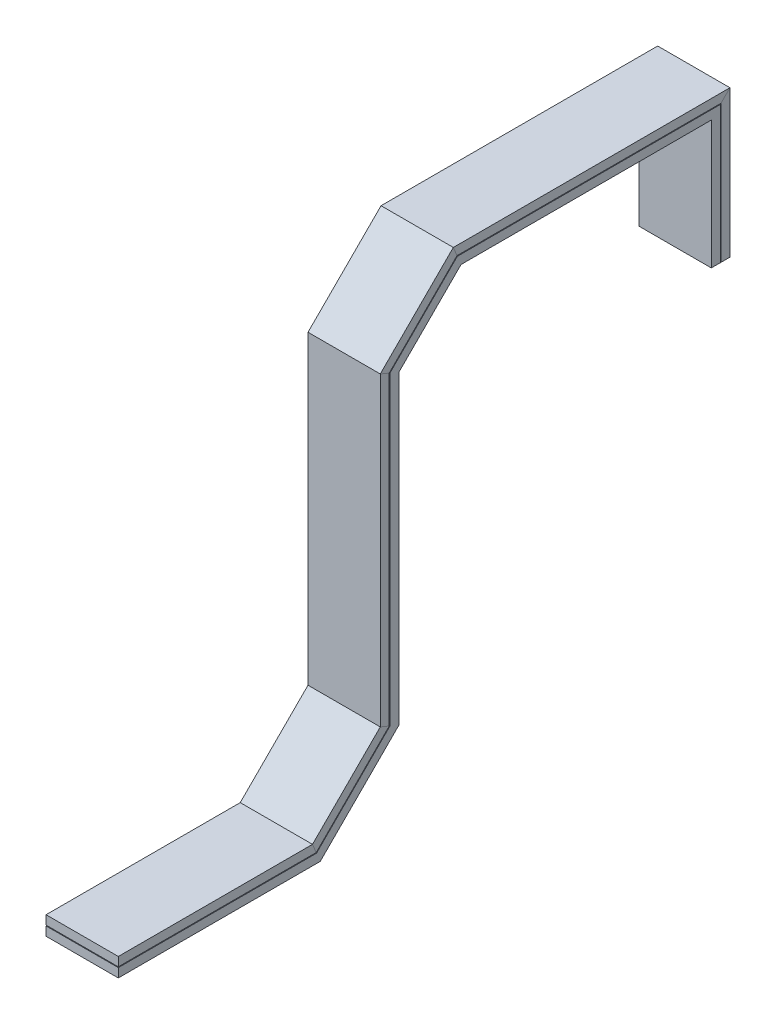
ISO-10303-21;
HEADER;
FILE_DESCRIPTION(('STEP AP214'),'2;1');
FILE_NAME('part.step','',(''),(''),'','','');
FILE_SCHEMA(('AUTOMOTIVE_DESIGN { 1 0 10303 214 1 1 1 1 }'));
ENDSEC;
DATA;
#1=APPLICATION_CONTEXT('core data for automotive mechanical design processes');
#2=APPLICATION_PROTOCOL_DEFINITION('international standard','automotive_design',2000,#1);
#3=PRODUCT_CONTEXT('',#1,'mechanical');
#4=PRODUCT('Part','Part','',(#3));
#5=PRODUCT_RELATED_PRODUCT_CATEGORY('part','',(#4));
#6=PRODUCT_DEFINITION_FORMATION('','',#4);
#7=PRODUCT_DEFINITION_CONTEXT('part definition',#1,'design');
#8=PRODUCT_DEFINITION('design','',#6,#7);
#9=PRODUCT_DEFINITION_SHAPE('','',#8);
#10=(LENGTH_UNIT() NAMED_UNIT(*) SI_UNIT(.MILLI.,.METRE.));
#11=(NAMED_UNIT(*) PLANE_ANGLE_UNIT() SI_UNIT($,.RADIAN.));
#12=(NAMED_UNIT(*) SI_UNIT($,.STERADIAN.) SOLID_ANGLE_UNIT());
#13=UNCERTAINTY_MEASURE_WITH_UNIT(LENGTH_MEASURE(1.E-05),#10,'distance_accuracy_value','');
#14=(GEOMETRIC_REPRESENTATION_CONTEXT(3) GLOBAL_UNCERTAINTY_ASSIGNED_CONTEXT((#13)) GLOBAL_UNIT_ASSIGNED_CONTEXT((#10,
#11,#12)) REPRESENTATION_CONTEXT('',''));
#15=CARTESIAN_POINT('',(0.,0.,0.));
#16=DIRECTION('',(0.,0.,1.));
#17=DIRECTION('',(1.,0.,0.));
#18=AXIS2_PLACEMENT_3D('',#15,#16,#17);
#19=CARTESIAN_POINT('',(25.4,0.,3.655));
#20=DIRECTION('',(0.,-1.,0.));
#21=DIRECTION('',(0.,0.,-1.));
#22=AXIS2_PLACEMENT_3D('',#19,#20,#21);
#23=PLANE('',#22);
#24=DIRECTION('',(0.,0.,1.));
#25=VECTOR('',#24,1.);
#26=CARTESIAN_POINT('',(-25.4,0.,3.655));
#27=LINE('',#26,#25);
#28=CARTESIAN_POINT('',(-25.4,0.,3.655));
#29=VERTEX_POINT('',#28);
#30=CARTESIAN_POINT('',(-25.4,0.,9.965));
#31=VERTEX_POINT('',#30);
#32=EDGE_CURVE('E178',#29,#31,#27,.T.);
#33=ORIENTED_EDGE('',*,*,#32,.F.);
#34=DIRECTION('',(-1.,0.,0.));
#35=VECTOR('',#34,1.);
#36=CARTESIAN_POINT('',(25.4,0.,3.655));
#37=LINE('',#36,#35);
#38=CARTESIAN_POINT('',(25.4,0.,3.655));
#39=VERTEX_POINT('',#38);
#40=EDGE_CURVE('E12',#39,#29,#37,.T.);
#41=ORIENTED_EDGE('',*,*,#40,.F.);
#42=DIRECTION('',(0.,0.,1.));
#43=VECTOR('',#42,1.);
#44=CARTESIAN_POINT('',(25.4,0.,3.655));
#45=LINE('',#44,#43);
#46=CARTESIAN_POINT('',(25.4,0.,9.965));
#47=VERTEX_POINT('',#46);
#48=EDGE_CURVE('E216',#39,#47,#45,.T.);
#49=ORIENTED_EDGE('',*,*,#48,.T.);
#50=DIRECTION('',(-1.,0.,0.));
#51=VECTOR('',#50,1.);
#52=CARTESIAN_POINT('',(25.4,0.,9.965));
#53=LINE('',#52,#51);
#54=EDGE_CURVE('E48',#47,#31,#53,.T.);
#55=ORIENTED_EDGE('',*,*,#54,.T.);
#56=EDGE_LOOP('',(#33,#41,#49,#55));
#57=FACE_BOUND('',#56,.T.);
#58=ADVANCED_FACE('F45',(#57),#23,.T.);
#59=CARTESIAN_POINT('',(25.4,0.,3.655));
#60=DIRECTION('',(0.,0.,-1.));
#61=DIRECTION('',(-1.,0.,0.));
#62=AXIS2_PLACEMENT_3D('',#59,#60,#61);
#63=PLANE('',#62);
#64=DIRECTION('',(0.,-1.,0.));
#65=VECTOR('',#64,1.);
#66=CARTESIAN_POINT('',(-25.4,0.,3.655));
#67=LINE('',#66,#65);
#68=CARTESIAN_POINT('',(-25.4,96.345,3.655));
#69=VERTEX_POINT('',#68);
#70=EDGE_CURVE('E214',#69,#29,#67,.T.);
#71=ORIENTED_EDGE('',*,*,#70,.F.);
#72=DIRECTION('',(-1.,0.,0.));
#73=VECTOR('',#72,1.);
#74=CARTESIAN_POINT('',(25.4,96.345,3.655));
#75=LINE('',#74,#73);
#76=CARTESIAN_POINT('',(25.4,96.345,3.655));
#77=VERTEX_POINT('',#76);
#78=EDGE_CURVE('E54',#77,#69,#75,.T.);
#79=ORIENTED_EDGE('',*,*,#78,.F.);
#80=DIRECTION('',(0.,-1.,0.));
#81=VECTOR('',#80,1.);
#82=CARTESIAN_POINT('',(25.4,0.,3.655));
#83=LINE('',#82,#81);
#84=EDGE_CURVE('E168',#77,#39,#83,.T.);
#85=ORIENTED_EDGE('',*,*,#84,.T.);
#86=ORIENTED_EDGE('',*,*,#40,.T.);
#87=EDGE_LOOP('',(#71,#79,#85,#86));
#88=FACE_BOUND('',#87,.T.);
#89=ADVANCED_FACE('F240',(#88),#63,.T.);
#90=CARTESIAN_POINT('',(25.4,96.345,3.655));
#91=DIRECTION('',(0.,1.,0.));
#92=DIRECTION('',(0.,0.,1.));
#93=AXIS2_PLACEMENT_3D('',#90,#91,#92);
#94=PLANE('',#93);
#95=DIRECTION('',(0.,0.,-1.));
#96=VECTOR('',#95,1.);
#97=CARTESIAN_POINT('',(-25.4,96.345,3.655));
#98=LINE('',#97,#96);
#99=CARTESIAN_POINT('',(-25.4,96.345,188.486049429528));
#100=VERTEX_POINT('',#99);
#101=EDGE_CURVE('E155',#100,#69,#98,.T.);
#102=ORIENTED_EDGE('',*,*,#101,.F.);
#103=DIRECTION('',(-1.,0.,0.));
#104=VECTOR('',#103,1.);
#105=CARTESIAN_POINT('',(25.4,96.345,188.486049429528));
#106=LINE('',#105,#104);
#107=CARTESIAN_POINT('',(25.4,96.345,188.486049429528));
#108=VERTEX_POINT('',#107);
#109=EDGE_CURVE('E150',#108,#100,#106,.T.);
#110=ORIENTED_EDGE('',*,*,#109,.F.);
#111=DIRECTION('',(0.,0.,-1.));
#112=VECTOR('',#111,1.);
#113=CARTESIAN_POINT('',(25.4,96.345,3.655));
#114=LINE('',#113,#112);
#115=EDGE_CURVE('E153',#108,#77,#114,.T.);
#116=ORIENTED_EDGE('',*,*,#115,.T.);
#117=ORIENTED_EDGE('',*,*,#78,.T.);
#118=EDGE_LOOP('',(#102,#110,#116,#117));
#119=FACE_BOUND('',#118,.T.);
#120=ADVANCED_FACE('F152',(#119),#94,.T.);
#121=CARTESIAN_POINT('',(25.4,96.345,188.486049429528));
#122=DIRECTION('',(0.,0.707106781186442,0.707106781186653));
#123=DIRECTION('',(0.,-0.707106781186653,0.707106781186442));
#124=AXIS2_PLACEMENT_3D('',#121,#122,#123);
#125=PLANE('',#124);
#126=DIRECTION('',(0.,0.707106781186653,-0.707106781186442));
#127=VECTOR('',#126,1.);
#128=CARTESIAN_POINT('',(-25.4,96.345,188.486049429528));
#129=LINE('',#128,#127);
#130=CARTESIAN_POINT('',(-25.4,48.9885747464298,235.842474683084));
#131=VERTEX_POINT('',#130);
#132=EDGE_CURVE('E211',#131,#100,#129,.T.);
#133=ORIENTED_EDGE('',*,*,#132,.F.);
#134=DIRECTION('',(-1.,0.,0.));
#135=VECTOR('',#134,1.);
#136=CARTESIAN_POINT('',(25.4,48.9885747464298,235.842474683084));
#137=LINE('',#136,#135);
#138=CARTESIAN_POINT('',(25.4,48.9885747464298,235.842474683084));
#139=VERTEX_POINT('',#138);
#140=EDGE_CURVE('E160',#139,#131,#137,.T.);
#141=ORIENTED_EDGE('',*,*,#140,.F.);
#142=DIRECTION('',(0.,0.707106781186653,-0.707106781186442));
#143=VECTOR('',#142,1.);
#144=CARTESIAN_POINT('',(25.4,96.345,188.486049429528));
#145=LINE('',#144,#143);
#146=EDGE_CURVE('E166',#139,#108,#145,.T.);
#147=ORIENTED_EDGE('',*,*,#146,.T.);
#148=ORIENTED_EDGE('',*,*,#109,.T.);
#149=EDGE_LOOP('',(#133,#141,#147,#148));
#150=FACE_BOUND('',#149,.T.);
#151=ADVANCED_FACE('F170',(#150),#125,.T.);
#152=CARTESIAN_POINT('',(25.4,48.9885747464298,235.842474683084));
#153=DIRECTION('',(0.,0.,1.));
#154=DIRECTION('',(0.,-1.,0.));
#155=AXIS2_PLACEMENT_3D('',#152,#153,#154);
#156=PLANE('',#155);
#157=DIRECTION('',(0.,1.,0.));
#158=VECTOR('',#157,1.);
#159=CARTESIAN_POINT('',(-25.4,48.9885747464298,235.842474683084));
#160=LINE('',#159,#158);
#161=CARTESIAN_POINT('',(-25.4,-165.896475887446,235.842474683084));
#162=VERTEX_POINT('',#161);
#163=EDGE_CURVE('E208',#162,#131,#160,.T.);
#164=ORIENTED_EDGE('',*,*,#163,.F.);
#165=DIRECTION('',(-1.,0.,0.));
#166=VECTOR('',#165,1.);
#167=CARTESIAN_POINT('',(25.4,-165.896475887446,235.842474683084));
#168=LINE('',#167,#166);
#169=CARTESIAN_POINT('',(25.4,-165.896475887446,235.842474683084));
#170=VERTEX_POINT('',#169);
#171=EDGE_CURVE('E220',#170,#162,#168,.T.);
#172=ORIENTED_EDGE('',*,*,#171,.F.);
#173=DIRECTION('',(0.,1.,0.));
#174=VECTOR('',#173,1.);
#175=CARTESIAN_POINT('',(25.4,48.9885747464298,235.842474683084));
#176=LINE('',#175,#174);
#177=EDGE_CURVE('E171',#170,#139,#176,.T.);
#178=ORIENTED_EDGE('',*,*,#177,.T.);
#179=ORIENTED_EDGE('',*,*,#140,.T.);
#180=EDGE_LOOP('',(#164,#172,#178,#179));
#181=FACE_BOUND('',#180,.T.);
#182=ADVANCED_FACE('F253',(#181),#156,.T.);
#183=CARTESIAN_POINT('',(25.4,-165.896475887446,235.842474683084));
#184=DIRECTION('',(0.,0.707106781186443,0.707106781186652));
#185=DIRECTION('',(0.,-0.707106781186652,0.707106781186443));
#186=AXIS2_PLACEMENT_3D('',#183,#184,#185);
#187=PLANE('',#186);
#188=DIRECTION('',(0.,0.707106781186652,-0.707106781186443));
#189=VECTOR('',#188,1.);
#190=CARTESIAN_POINT('',(-25.4,-165.896475887446,235.842474683084));
#191=LINE('',#190,#189);
#192=CARTESIAN_POINT('',(-25.4,-217.535000000027,287.48099879565));
#193=VERTEX_POINT('',#192);
#194=EDGE_CURVE('E205',#193,#162,#191,.T.);
#195=ORIENTED_EDGE('',*,*,#194,.F.);
#196=DIRECTION('',(-1.,0.,0.));
#197=VECTOR('',#196,1.);
#198=CARTESIAN_POINT('',(25.4,-217.535000000027,287.48099879565));
#199=LINE('',#198,#197);
#200=CARTESIAN_POINT('',(25.4,-217.535000000027,287.48099879565));
#201=VERTEX_POINT('',#200);
#202=EDGE_CURVE('E222',#201,#193,#199,.T.);
#203=ORIENTED_EDGE('',*,*,#202,.F.);
#204=DIRECTION('',(0.,0.707106781186652,-0.707106781186443));
#205=VECTOR('',#204,1.);
#206=CARTESIAN_POINT('',(25.4,-165.896475887446,235.842474683084));
#207=LINE('',#206,#205);
#208=EDGE_CURVE('E173',#201,#170,#207,.T.);
#209=ORIENTED_EDGE('',*,*,#208,.T.);
#210=ORIENTED_EDGE('',*,*,#171,.T.);
#211=EDGE_LOOP('',(#195,#203,#209,#210));
#212=FACE_BOUND('',#211,.T.);
#213=ADVANCED_FACE('F256',(#212),#187,.T.);
#214=CARTESIAN_POINT('',(25.4,-217.535000000027,287.48099879565));
#215=DIRECTION('',(0.,1.,0.));
#216=DIRECTION('',(0.,0.,1.));
#217=AXIS2_PLACEMENT_3D('',#214,#215,#216);
#218=PLANE('',#217);
#219=DIRECTION('',(0.,0.,-1.));
#220=VECTOR('',#219,1.);
#221=CARTESIAN_POINT('',(-25.4,-217.535000000027,287.48099879565));
#222=LINE('',#221,#220);
#223=CARTESIAN_POINT('',(-25.4,-217.535000000027,426.794949366123));
#224=VERTEX_POINT('',#223);
#225=EDGE_CURVE('E202',#224,#193,#222,.T.);
#226=ORIENTED_EDGE('',*,*,#225,.F.);
#227=DIRECTION('',(-1.,0.,0.));
#228=VECTOR('',#227,1.);
#229=CARTESIAN_POINT('',(25.4,-217.535000000027,426.794949366123));
#230=LINE('',#229,#228);
#231=CARTESIAN_POINT('',(25.4,-217.535000000027,426.794949366123));
#232=VERTEX_POINT('',#231);
#233=EDGE_CURVE('E224',#232,#224,#230,.T.);
#234=ORIENTED_EDGE('',*,*,#233,.F.);
#235=DIRECTION('',(0.,0.,-1.));
#236=VECTOR('',#235,1.);
#237=CARTESIAN_POINT('',(25.4,-217.535000000027,287.48099879565));
#238=LINE('',#237,#236);
#239=EDGE_CURVE('E413',#232,#201,#238,.T.);
#240=ORIENTED_EDGE('',*,*,#239,.T.);
#241=ORIENTED_EDGE('',*,*,#202,.T.);
#242=EDGE_LOOP('',(#226,#234,#240,#241));
#243=FACE_BOUND('',#242,.T.);
#244=ADVANCED_FACE('F260',(#243),#218,.T.);
#245=CARTESIAN_POINT('',(25.4,-217.535000000027,426.794949366123));
#246=DIRECTION('',(0.,0.,1.));
#247=DIRECTION('',(1.,0.,0.));
#248=AXIS2_PLACEMENT_3D('',#245,#246,#247);
#249=PLANE('',#248);
#250=DIRECTION('',(0.,1.,0.));
#251=VECTOR('',#250,1.);
#252=CARTESIAN_POINT('',(-25.4,-217.535000000027,426.794949366123));
#253=LINE('',#252,#251);
#254=CARTESIAN_POINT('',(-25.4,-223.845000000027,426.794949366123));
#255=VERTEX_POINT('',#254);
#256=EDGE_CURVE('E199',#255,#224,#253,.T.);
#257=ORIENTED_EDGE('',*,*,#256,.F.);
#258=DIRECTION('',(-1.,0.,0.));
#259=VECTOR('',#258,1.);
#260=CARTESIAN_POINT('',(25.4,-223.845000000027,426.794949366123));
#261=LINE('',#260,#259);
#262=CARTESIAN_POINT('',(25.4,-223.845000000027,426.794949366123));
#263=VERTEX_POINT('',#262);
#264=EDGE_CURVE('E226',#263,#255,#261,.T.);
#265=ORIENTED_EDGE('',*,*,#264,.F.);
#266=DIRECTION('',(0.,1.,0.));
#267=VECTOR('',#266,1.);
#268=CARTESIAN_POINT('',(25.4,-217.535000000027,426.794949366123));
#269=LINE('',#268,#267);
#270=EDGE_CURVE('E406',#263,#232,#269,.T.);
#271=ORIENTED_EDGE('',*,*,#270,.T.);
#272=ORIENTED_EDGE('',*,*,#233,.T.);
#273=EDGE_LOOP('',(#257,#265,#271,#272));
#274=FACE_BOUND('',#273,.T.);
#275=ADVANCED_FACE('F264',(#274),#249,.T.);
#276=CARTESIAN_POINT('',(25.4,-223.845000000027,284.867311217075));
#277=DIRECTION('',(0.,-1.,0.));
#278=DIRECTION('',(0.,0.,-1.));
#279=AXIS2_PLACEMENT_3D('',#276,#277,#278);
#280=PLANE('',#279);
#281=DIRECTION('',(0.,0.,1.));
#282=VECTOR('',#281,1.);
#283=CARTESIAN_POINT('',(-25.4,-223.845000000027,284.867311217075));
#284=LINE('',#283,#282);
#285=CARTESIAN_POINT('',(-25.4,-223.845000000027,284.867311217075));
#286=VERTEX_POINT('',#285);
#287=EDGE_CURVE('E196',#286,#255,#284,.T.);
#288=ORIENTED_EDGE('',*,*,#287,.F.);
#289=DIRECTION('',(-1.,0.,0.));
#290=VECTOR('',#289,1.);
#291=CARTESIAN_POINT('',(25.4,-223.845000000027,284.867311217075));
#292=LINE('',#291,#290);
#293=CARTESIAN_POINT('',(25.4,-223.845000000027,284.867311217075));
#294=VERTEX_POINT('',#293);
#295=EDGE_CURVE('E228',#294,#286,#292,.T.);
#296=ORIENTED_EDGE('',*,*,#295,.F.);
#297=DIRECTION('',(0.,0.,1.));
#298=VECTOR('',#297,1.);
#299=CARTESIAN_POINT('',(25.4,-223.845000000027,284.867311217075));
#300=LINE('',#299,#298);
#301=EDGE_CURVE('E402',#294,#263,#300,.T.);
#302=ORIENTED_EDGE('',*,*,#301,.T.);
#303=ORIENTED_EDGE('',*,*,#264,.T.);
#304=EDGE_LOOP('',(#288,#296,#302,#303));
#305=FACE_BOUND('',#304,.T.);
#306=ADVANCED_FACE('F268',(#305),#280,.T.);
#307=CARTESIAN_POINT('',(25.4,-168.51016346602,229.532474683084));
#308=DIRECTION('',(0.,-0.70710678118645,-0.707106781186645));
#309=DIRECTION('',(0.,0.707106781186645,-0.70710678118645));
#310=AXIS2_PLACEMENT_3D('',#307,#308,#309);
#311=PLANE('',#310);
#312=DIRECTION('',(0.,-0.707106781186645,0.70710678118645));
#313=VECTOR('',#312,1.);
#314=CARTESIAN_POINT('',(-25.4,-168.51016346602,229.532474683084));
#315=LINE('',#314,#313);
#316=CARTESIAN_POINT('',(-25.4,-168.51016346602,229.532474683084));
#317=VERTEX_POINT('',#316);
#318=EDGE_CURVE('E193',#317,#286,#315,.T.);
#319=ORIENTED_EDGE('',*,*,#318,.F.);
#320=DIRECTION('',(-1.,0.,0.));
#321=VECTOR('',#320,1.);
#322=CARTESIAN_POINT('',(25.4,-168.51016346602,229.532474683084));
#323=LINE('',#322,#321);
#324=CARTESIAN_POINT('',(25.4,-168.51016346602,229.532474683084));
#325=VERTEX_POINT('',#324);
#326=EDGE_CURVE('E230',#325,#317,#323,.T.);
#327=ORIENTED_EDGE('',*,*,#326,.F.);
#328=DIRECTION('',(0.,-0.707106781186645,0.70710678118645));
#329=VECTOR('',#328,1.);
#330=CARTESIAN_POINT('',(25.4,-168.51016346602,229.532474683084));
#331=LINE('',#330,#329);
#332=EDGE_CURVE('E418',#325,#294,#331,.T.);
#333=ORIENTED_EDGE('',*,*,#332,.T.);
#334=ORIENTED_EDGE('',*,*,#295,.T.);
#335=EDGE_LOOP('',(#319,#327,#333,#334));
#336=FACE_BOUND('',#335,.T.);
#337=ADVANCED_FACE('F272',(#336),#311,.T.);
#338=CARTESIAN_POINT('',(25.4,46.3748871678561,229.532474683084));
#339=DIRECTION('',(0.,0.,-1.));
#340=DIRECTION('',(0.,1.,0.));
#341=AXIS2_PLACEMENT_3D('',#338,#339,#340);
#342=PLANE('',#341);
#343=DIRECTION('',(0.,-1.,0.));
#344=VECTOR('',#343,1.);
#345=CARTESIAN_POINT('',(-25.4,46.3748871678561,229.532474683084));
#346=LINE('',#345,#344);
#347=CARTESIAN_POINT('',(-25.4,46.3748871678561,229.532474683084));
#348=VERTEX_POINT('',#347);
#349=EDGE_CURVE('E190',#348,#317,#346,.T.);
#350=ORIENTED_EDGE('',*,*,#349,.F.);
#351=DIRECTION('',(-1.,0.,0.));
#352=VECTOR('',#351,1.);
#353=CARTESIAN_POINT('',(25.4,46.3748871678561,229.532474683084));
#354=LINE('',#353,#352);
#355=CARTESIAN_POINT('',(25.4,46.3748871678561,229.532474683084));
#356=VERTEX_POINT('',#355);
#357=EDGE_CURVE('E232',#356,#348,#354,.T.);
#358=ORIENTED_EDGE('',*,*,#357,.F.);
#359=DIRECTION('',(0.,-1.,0.));
#360=VECTOR('',#359,1.);
#361=CARTESIAN_POINT('',(25.4,46.3748871678561,229.532474683084));
#362=LINE('',#361,#360);
#363=EDGE_CURVE('E395',#356,#325,#362,.T.);
#364=ORIENTED_EDGE('',*,*,#363,.T.);
#365=ORIENTED_EDGE('',*,*,#326,.T.);
#366=EDGE_LOOP('',(#350,#358,#364,#365));
#367=FACE_BOUND('',#366,.T.);
#368=ADVANCED_FACE('F276',(#367),#342,.T.);
#369=CARTESIAN_POINT('',(25.4,90.035,185.872361850954));
#370=DIRECTION('',(0.,-0.707106781186433,-0.707106781186661));
#371=DIRECTION('',(0.,0.707106781186662,-0.707106781186433));
#372=AXIS2_PLACEMENT_3D('',#369,#370,#371);
#373=PLANE('',#372);
#374=DIRECTION('',(0.,-0.707106781186662,0.707106781186434));
#375=VECTOR('',#374,1.);
#376=CARTESIAN_POINT('',(-25.4,90.035,185.872361850954));
#377=LINE('',#376,#375);
#378=CARTESIAN_POINT('',(-25.4,90.035,185.872361850954));
#379=VERTEX_POINT('',#378);
#380=EDGE_CURVE('E187',#379,#348,#377,.T.);
#381=ORIENTED_EDGE('',*,*,#380,.F.);
#382=DIRECTION('',(-1.,0.,0.));
#383=VECTOR('',#382,1.);
#384=CARTESIAN_POINT('',(25.4,90.035,185.872361850954));
#385=LINE('',#384,#383);
#386=CARTESIAN_POINT('',(25.4,90.035,185.872361850954));
#387=VERTEX_POINT('',#386);
#388=EDGE_CURVE('E234',#387,#379,#385,.T.);
#389=ORIENTED_EDGE('',*,*,#388,.F.);
#390=DIRECTION('',(0.,-0.707106781186662,0.707106781186434));
#391=VECTOR('',#390,1.);
#392=CARTESIAN_POINT('',(25.4,90.035,185.872361850954));
#393=LINE('',#392,#391);
#394=EDGE_CURVE('E391',#387,#356,#393,.T.);
#395=ORIENTED_EDGE('',*,*,#394,.T.);
#396=ORIENTED_EDGE('',*,*,#357,.T.);
#397=EDGE_LOOP('',(#381,#389,#395,#396));
#398=FACE_BOUND('',#397,.T.);
#399=ADVANCED_FACE('F280',(#398),#373,.T.);
#400=CARTESIAN_POINT('',(25.4,90.035,9.965));
#401=DIRECTION('',(0.,-1.,0.));
#402=DIRECTION('',(0.,0.,-1.));
#403=AXIS2_PLACEMENT_3D('',#400,#401,#402);
#404=PLANE('',#403);
#405=DIRECTION('',(0.,0.,1.));
#406=VECTOR('',#405,1.);
#407=CARTESIAN_POINT('',(-25.4,90.035,9.965));
#408=LINE('',#407,#406);
#409=CARTESIAN_POINT('',(-25.4,90.035,9.965));
#410=VERTEX_POINT('',#409);
#411=EDGE_CURVE('E184',#410,#379,#408,.T.);
#412=ORIENTED_EDGE('',*,*,#411,.F.);
#413=DIRECTION('',(-1.,0.,0.));
#414=VECTOR('',#413,1.);
#415=CARTESIAN_POINT('',(25.4,90.035,9.965));
#416=LINE('',#415,#414);
#417=CARTESIAN_POINT('',(25.4,90.035,9.965));
#418=VERTEX_POINT('',#417);
#419=EDGE_CURVE('E235',#418,#410,#416,.T.);
#420=ORIENTED_EDGE('',*,*,#419,.F.);
#421=DIRECTION('',(0.,0.,1.));
#422=VECTOR('',#421,1.);
#423=CARTESIAN_POINT('',(25.4,90.035,9.965));
#424=LINE('',#423,#422);
#425=EDGE_CURVE('E422',#418,#387,#424,.T.);
#426=ORIENTED_EDGE('',*,*,#425,.T.);
#427=ORIENTED_EDGE('',*,*,#388,.T.);
#428=EDGE_LOOP('',(#412,#420,#426,#427));
#429=FACE_BOUND('',#428,.T.);
#430=ADVANCED_FACE('F284',(#429),#404,.T.);
#431=CARTESIAN_POINT('',(25.4,0.,9.965));
#432=DIRECTION('',(0.,0.,1.));
#433=DIRECTION('',(1.,0.,0.));
#434=AXIS2_PLACEMENT_3D('',#431,#432,#433);
#435=PLANE('',#434);
#436=DIRECTION('',(0.,1.,0.));
#437=VECTOR('',#436,1.);
#438=CARTESIAN_POINT('',(-25.4,0.,9.965));
#439=LINE('',#438,#437);
#440=EDGE_CURVE('E181',#31,#410,#439,.T.);
#441=ORIENTED_EDGE('',*,*,#440,.F.);
#442=ORIENTED_EDGE('',*,*,#54,.F.);
#443=DIRECTION('',(0.,1.,0.));
#444=VECTOR('',#443,1.);
#445=CARTESIAN_POINT('',(25.4,0.,9.965));
#446=LINE('',#445,#444);
#447=EDGE_CURVE('E424',#47,#418,#446,.T.);
#448=ORIENTED_EDGE('',*,*,#447,.T.);
#449=ORIENTED_EDGE('',*,*,#419,.T.);
#450=EDGE_LOOP('',(#441,#442,#448,#449));
#451=FACE_BOUND('',#450,.T.);
#452=ADVANCED_FACE('F237',(#451),#435,.T.);
#453=CARTESIAN_POINT('',(25.4,0.,0.));
#454=DIRECTION('',(-1.,0.,0.));
#455=DIRECTION('',(0.,0.,1.));
#456=AXIS2_PLACEMENT_3D('',#453,#454,#455);
#457=PLANE('',#456);
#458=ORIENTED_EDGE('',*,*,#48,.F.);
#459=ORIENTED_EDGE('',*,*,#84,.F.);
#460=ORIENTED_EDGE('',*,*,#115,.F.);
#461=ORIENTED_EDGE('',*,*,#146,.F.);
#462=ORIENTED_EDGE('',*,*,#177,.F.);
#463=ORIENTED_EDGE('',*,*,#208,.F.);
#464=ORIENTED_EDGE('',*,*,#239,.F.);
#465=ORIENTED_EDGE('',*,*,#270,.F.);
#466=ORIENTED_EDGE('',*,*,#301,.F.);
#467=ORIENTED_EDGE('',*,*,#332,.F.);
#468=ORIENTED_EDGE('',*,*,#363,.F.);
#469=ORIENTED_EDGE('',*,*,#394,.F.);
#470=ORIENTED_EDGE('',*,*,#425,.F.);
#471=ORIENTED_EDGE('',*,*,#447,.F.);
#472=EDGE_LOOP('',(#458,#459,#460,#461,#462,#463,#464,#465,#466,#467,#468,#469,#470,#471));
#473=FACE_BOUND('',#472,.T.);
#474=ADVANCED_FACE('F164',(#473),#457,.F.);
#475=CARTESIAN_POINT('',(-25.4,0.,0.));
#476=DIRECTION('',(-1.,0.,0.));
#477=DIRECTION('',(0.,0.,1.));
#478=AXIS2_PLACEMENT_3D('',#475,#476,#477);
#479=PLANE('',#478);
#480=ORIENTED_EDGE('',*,*,#32,.T.);
#481=ORIENTED_EDGE('',*,*,#440,.T.);
#482=ORIENTED_EDGE('',*,*,#411,.T.);
#483=ORIENTED_EDGE('',*,*,#380,.T.);
#484=ORIENTED_EDGE('',*,*,#349,.T.);
#485=ORIENTED_EDGE('',*,*,#318,.T.);
#486=ORIENTED_EDGE('',*,*,#287,.T.);
#487=ORIENTED_EDGE('',*,*,#256,.T.);
#488=ORIENTED_EDGE('',*,*,#225,.T.);
#489=ORIENTED_EDGE('',*,*,#194,.T.);
#490=ORIENTED_EDGE('',*,*,#163,.T.);
#491=ORIENTED_EDGE('',*,*,#132,.T.);
#492=ORIENTED_EDGE('',*,*,#101,.T.);
#493=ORIENTED_EDGE('',*,*,#70,.T.);
#494=EDGE_LOOP('',(#480,#481,#482,#483,#484,#485,#486,#487,#488,#489,#490,#491,#492,#493));
#495=FACE_BOUND('',#494,.T.);
#496=ADVANCED_FACE('F239',(#495),#479,.T.);
#497=CLOSED_SHELL('',(#58,#89,#120,#151,#182,#213,#244,#275,#306,#337,#368,#399,#430,#452,#474,#496));
#498=MANIFOLD_SOLID_BREP('B2',#497);
#499=CARTESIAN_POINT('',(5.84511048808304E-12,-213.880000000029,426.794949366123));
#500=DIRECTION('',(0.,0.,1.));
#501=DIRECTION('',(0.,-1.,0.));
#502=AXIS2_PLACEMENT_3D('',#499,#500,#501);
#503=PLANE('',#502);
#504=DIRECTION('',(0.,1.,0.));
#505=VECTOR('',#504,1.);
#506=CARTESIAN_POINT('',(25.4000000000061,-210.725000000031,426.794949366123));
#507=LINE('',#506,#505);
#508=CARTESIAN_POINT('',(25.4000000000055,-217.035000000031,426.794949366123));
#509=VERTEX_POINT('',#508);
#510=CARTESIAN_POINT('',(25.4000000000061,-210.725000000031,426.794949366123));
#511=VERTEX_POINT('',#510);
#512=EDGE_CURVE('E516',#509,#511,#507,.T.);
#513=ORIENTED_EDGE('',*,*,#512,.T.);
#514=DIRECTION('',(-1.,0.,0.));
#515=VECTOR('',#514,1.);
#516=CARTESIAN_POINT('',(-25.3999999999939,-210.725000000027,426.794949366123));
#517=LINE('',#516,#515);
#518=CARTESIAN_POINT('',(-25.3999999999939,-210.725000000027,426.794949366123));
#519=VERTEX_POINT('',#518);
#520=EDGE_CURVE('E514',#511,#519,#517,.T.);
#521=ORIENTED_EDGE('',*,*,#520,.T.);
#522=DIRECTION('',(0.,-1.,0.));
#523=VECTOR('',#522,1.);
#524=CARTESIAN_POINT('',(-25.3999999999939,-210.725000000027,426.794949366123));
#525=LINE('',#524,#523);
#526=CARTESIAN_POINT('',(-25.3999999999945,-217.035000000027,426.794949366123));
#527=VERTEX_POINT('',#526);
#528=EDGE_CURVE('E511',#519,#527,#525,.T.);
#529=ORIENTED_EDGE('',*,*,#528,.T.);
#530=DIRECTION('',(1.,0.,0.));
#531=VECTOR('',#530,1.);
#532=CARTESIAN_POINT('',(-25.3999999999945,-217.035000000027,426.794949366123));
#533=LINE('',#532,#531);
#534=EDGE_CURVE('E530',#527,#509,#533,.T.);
#535=ORIENTED_EDGE('',*,*,#534,.T.);
#536=EDGE_LOOP('',(#513,#521,#529,#535));
#537=FACE_BOUND('',#536,.T.);
#538=ADVANCED_FACE('F429',(#537),#503,.T.);
#539=CARTESIAN_POINT('',(0.,0.,0.));
#540=DIRECTION('',(0.,1.,0.));
#541=DIRECTION('',(0.,0.,1.));
#542=AXIS2_PLACEMENT_3D('',#539,#540,#541);
#543=PLANE('',#542);
#544=DIRECTION('',(0.,0.,-1.));
#545=VECTOR('',#544,1.);
#546=CARTESIAN_POINT('',(25.4,0.,-3.155));
#547=LINE('',#546,#545);
#548=CARTESIAN_POINT('',(25.4,0.,3.155));
#549=VERTEX_POINT('',#548);
#550=CARTESIAN_POINT('',(25.4,0.,-3.155));
#551=VERTEX_POINT('',#550);
#552=EDGE_CURVE('E644',#549,#551,#547,.T.);
#553=ORIENTED_EDGE('',*,*,#552,.F.);
#554=DIRECTION('',(1.,0.,0.));
#555=VECTOR('',#554,1.);
#556=CARTESIAN_POINT('',(-25.4,0.,3.155));
#557=LINE('',#556,#555);
#558=CARTESIAN_POINT('',(-25.4,0.,3.155));
#559=VERTEX_POINT('',#558);
#560=EDGE_CURVE('E650',#559,#549,#557,.T.);
#561=ORIENTED_EDGE('',*,*,#560,.F.);
#562=DIRECTION('',(0.,0.,1.));
#563=VECTOR('',#562,1.);
#564=CARTESIAN_POINT('',(-25.4,0.,-3.155));
#565=LINE('',#564,#563);
#566=CARTESIAN_POINT('',(-25.4,0.,-3.155));
#567=VERTEX_POINT('',#566);
#568=EDGE_CURVE('E634',#567,#559,#565,.T.);
#569=ORIENTED_EDGE('',*,*,#568,.F.);
#570=DIRECTION('',(-1.,0.,0.));
#571=VECTOR('',#570,1.);
#572=CARTESIAN_POINT('',(-25.4,0.,-3.155));
#573=LINE('',#572,#571);
#574=EDGE_CURVE('E640',#551,#567,#573,.T.);
#575=ORIENTED_EDGE('',*,*,#574,.F.);
#576=EDGE_LOOP('',(#553,#561,#569,#575));
#577=FACE_BOUND('',#576,.T.);
#578=ADVANCED_FACE('F683',(#577),#543,.F.);
#579=CARTESIAN_POINT('',(-25.3999999999939,-210.725000000027,287.457421197906));
#580=DIRECTION('',(-1.,0.,0.));
#581=DIRECTION('',(0.,-1.,0.));
#582=AXIS2_PLACEMENT_3D('',#579,#580,#581);
#583=PLANE('',#582);
#584=DIRECTION('',(0.,0.923879532511259,0.382683432365158));
#585=VECTOR('',#584,1.);
#586=CARTESIAN_POINT('',(-25.3999999999915,-185.894703414158,300.586838759027));
#587=LINE('',#586,#585);
#588=CARTESIAN_POINT('',(-25.3999999999945,-217.035000000027,287.688105576837));
#589=VERTEX_POINT('',#588);
#590=CARTESIAN_POINT('',(-25.3999999999939,-210.725000000027,290.301793155411));
#591=VERTEX_POINT('',#590);
#592=EDGE_CURVE('E546',#589,#591,#587,.T.);
#593=ORIENTED_EDGE('',*,*,#592,.F.);
#594=DIRECTION('',(0.,0.,1.));
#595=VECTOR('',#594,1.);
#596=CARTESIAN_POINT('',(-25.3999999999945,-217.035000000027,287.457421197906));
#597=LINE('',#596,#595);
#598=EDGE_CURVE('E528',#589,#527,#597,.T.);
#599=ORIENTED_EDGE('',*,*,#598,.T.);
#600=ORIENTED_EDGE('',*,*,#528,.F.);
#601=DIRECTION('',(0.,0.,1.));
#602=VECTOR('',#601,1.);
#603=CARTESIAN_POINT('',(-25.3999999999939,-210.725000000027,287.457421197906));
#604=LINE('',#603,#602);
#605=EDGE_CURVE('E432',#591,#519,#604,.T.);
#606=ORIENTED_EDGE('',*,*,#605,.F.);
#607=EDGE_LOOP('',(#593,#599,#600,#606));
#608=FACE_BOUND('',#607,.T.);
#609=ADVANCED_FACE('F525',(#608),#583,.T.);
#610=CARTESIAN_POINT('',(-25.3999999999945,-217.035000000027,287.457421197906));
#611=DIRECTION('',(0.,-1.,0.));
#612=DIRECTION('',(1.,0.,0.));
#613=AXIS2_PLACEMENT_3D('',#610,#611,#612);
#614=PLANE('',#613);
#615=DIRECTION('',(-1.,0.,0.));
#616=VECTOR('',#615,1.);
#617=CARTESIAN_POINT('',(-25.3999999999969,-217.035000000027,287.688105576837));
#618=LINE('',#617,#616);
#619=CARTESIAN_POINT('',(25.4000000000055,-217.035000000031,287.688105576835));
#620=VERTEX_POINT('',#619);
#621=EDGE_CURVE('E560',#620,#589,#618,.T.);
#622=ORIENTED_EDGE('',*,*,#621,.F.);
#623=DIRECTION('',(0.,0.,1.));
#624=VECTOR('',#623,1.);
#625=CARTESIAN_POINT('',(25.4000000000055,-217.035000000031,287.457421197906));
#626=LINE('',#625,#624);
#627=EDGE_CURVE('E539',#620,#509,#626,.T.);
#628=ORIENTED_EDGE('',*,*,#627,.T.);
#629=ORIENTED_EDGE('',*,*,#534,.F.);
#630=ORIENTED_EDGE('',*,*,#598,.F.);
#631=EDGE_LOOP('',(#622,#628,#629,#630));
#632=FACE_BOUND('',#631,.T.);
#633=ADVANCED_FACE('F740',(#632),#614,.T.);
#634=CARTESIAN_POINT('',(25.4000000000061,-210.725000000031,287.457421197906));
#635=DIRECTION('',(1.,0.,0.));
#636=DIRECTION('',(0.,1.,0.));
#637=AXIS2_PLACEMENT_3D('',#634,#635,#636);
#638=PLANE('',#637);
#639=DIRECTION('',(0.,-0.923879532511259,-0.382683432365158));
#640=VECTOR('',#639,1.);
#641=CARTESIAN_POINT('',(25.4000000000085,-185.894703414162,300.586838759025));
#642=LINE('',#641,#640);
#643=CARTESIAN_POINT('',(25.4000000000061,-210.725000000031,290.30179315541));
#644=VERTEX_POINT('',#643);
#645=EDGE_CURVE('E557',#644,#620,#642,.T.);
#646=ORIENTED_EDGE('',*,*,#645,.F.);
#647=DIRECTION('',(0.,0.,1.));
#648=VECTOR('',#647,1.);
#649=CARTESIAN_POINT('',(25.4000000000061,-210.725000000031,287.457421197906));
#650=LINE('',#649,#648);
#651=EDGE_CURVE('E529',#644,#511,#650,.T.);
#652=ORIENTED_EDGE('',*,*,#651,.T.);
#653=ORIENTED_EDGE('',*,*,#512,.F.);
#654=ORIENTED_EDGE('',*,*,#627,.F.);
#655=EDGE_LOOP('',(#646,#652,#653,#654));
#656=FACE_BOUND('',#655,.T.);
#657=ADVANCED_FACE('F743',(#656),#638,.T.);
#658=CARTESIAN_POINT('',(-25.3999999999939,-210.725000000027,287.457421197906));
#659=DIRECTION('',(0.,1.,0.));
#660=DIRECTION('',(-1.,0.,0.));
#661=AXIS2_PLACEMENT_3D('',#658,#659,#660);
#662=PLANE('',#661);
#663=DIRECTION('',(1.,0.,0.));
#664=VECTOR('',#663,1.);
#665=CARTESIAN_POINT('',(-25.3999999999963,-210.725000000027,290.301793155411));
#666=LINE('',#665,#664);
#667=EDGE_CURVE('E534',#591,#644,#666,.T.);
#668=ORIENTED_EDGE('',*,*,#667,.F.);
#669=ORIENTED_EDGE('',*,*,#605,.T.);
#670=ORIENTED_EDGE('',*,*,#520,.F.);
#671=ORIENTED_EDGE('',*,*,#651,.F.);
#672=EDGE_LOOP('',(#668,#669,#670,#671));
#673=FACE_BOUND('',#672,.T.);
#674=ADVANCED_FACE('F532',(#673),#662,.T.);
#675=CARTESIAN_POINT('',(-25.3999999999932,-161.064406828289,240.641199983688));
#676=DIRECTION('',(0.,0.707106781186443,0.707106781186652));
#677=DIRECTION('',(0.,-0.707106781186652,0.707106781186443));
#678=AXIS2_PLACEMENT_3D('',#675,#676,#677);
#679=PLANE('',#678);
#680=DIRECTION('',(0.,-0.707106781186652,0.707106781186443));
#681=VECTOR('',#680,1.);
#682=CARTESIAN_POINT('',(-25.3999999999932,-161.064406828289,240.641199983688));
#683=LINE('',#682,#681);
#684=CARTESIAN_POINT('',(-25.3999999999933,-163.075681527658,242.652474683057));
#685=VERTEX_POINT('',#684);
#686=EDGE_CURVE('E548',#685,#591,#683,.T.);
#687=ORIENTED_EDGE('',*,*,#686,.T.);
#688=ORIENTED_EDGE('',*,*,#667,.T.);
#689=DIRECTION('',(0.,-0.707106781186652,0.707106781186443));
#690=VECTOR('',#689,1.);
#691=CARTESIAN_POINT('',(25.4000000000067,-161.064406828292,240.641199983685));
#692=LINE('',#691,#690);
#693=CARTESIAN_POINT('',(25.4000000000067,-163.07568152766,242.652474683052));
#694=VERTEX_POINT('',#693);
#695=EDGE_CURVE('E535',#694,#644,#692,.T.);
#696=ORIENTED_EDGE('',*,*,#695,.F.);
#697=DIRECTION('',(1.,0.,0.));
#698=VECTOR('',#697,1.);
#699=CARTESIAN_POINT('',(-25.4000000000016,-163.075681527658,242.652474683057));
#700=LINE('',#699,#698);
#701=EDGE_CURVE('E567',#685,#694,#700,.T.);
#702=ORIENTED_EDGE('',*,*,#701,.F.);
#703=EDGE_LOOP('',(#687,#688,#696,#702));
#704=FACE_BOUND('',#703,.T.);
#705=ADVANCED_FACE('F736',(#704),#679,.T.);
#706=CARTESIAN_POINT('',(25.4000000000067,-161.064406828292,240.641199983685));
#707=DIRECTION('',(1.,0.,0.));
#708=DIRECTION('',(0.,1.,0.));
#709=AXIS2_PLACEMENT_3D('',#706,#707,#708);
#710=PLANE('',#709);
#711=ORIENTED_EDGE('',*,*,#695,.T.);
#712=ORIENTED_EDGE('',*,*,#645,.T.);
#713=DIRECTION('',(0.,-0.707106781186652,0.707106781186443));
#714=VECTOR('',#713,1.);
#715=CARTESIAN_POINT('',(25.4000000000062,-165.526250617579,236.179356194398));
#716=LINE('',#715,#714);
#717=CARTESIAN_POINT('',(25.4000000000062,-165.689369106233,236.342474683052));
#718=VERTEX_POINT('',#717);
#719=EDGE_CURVE('E537',#718,#620,#716,.T.);
#720=ORIENTED_EDGE('',*,*,#719,.F.);
#721=DIRECTION('',(0.,-0.382683432364961,-0.92387953251134));
#722=VECTOR('',#721,1.);
#723=CARTESIAN_POINT('',(25.4000000000134,-131.572711505009,318.707372166798));
#724=LINE('',#723,#722);
#725=EDGE_CURVE('E581',#694,#718,#724,.T.);
#726=ORIENTED_EDGE('',*,*,#725,.F.);
#727=EDGE_LOOP('',(#711,#712,#720,#726));
#728=FACE_BOUND('',#727,.T.);
#729=ADVANCED_FACE('F727',(#728),#710,.T.);
#730=CARTESIAN_POINT('',(-25.3999999999938,-165.526250617575,236.179356194401));
#731=DIRECTION('',(0.,-0.707106781186443,-0.707106781186652));
#732=DIRECTION('',(0.,0.707106781186652,-0.707106781186443));
#733=AXIS2_PLACEMENT_3D('',#730,#731,#732);
#734=PLANE('',#733);
#735=ORIENTED_EDGE('',*,*,#719,.T.);
#736=ORIENTED_EDGE('',*,*,#621,.T.);
#737=DIRECTION('',(0.,-0.707106781186652,0.707106781186443));
#738=VECTOR('',#737,1.);
#739=CARTESIAN_POINT('',(-25.3999999999938,-165.526250617575,236.179356194401));
#740=LINE('',#739,#738);
#741=CARTESIAN_POINT('',(-25.3999999999938,-165.689369106231,236.342474683056));
#742=VERTEX_POINT('',#741);
#743=EDGE_CURVE('E551',#742,#589,#740,.T.);
#744=ORIENTED_EDGE('',*,*,#743,.F.);
#745=DIRECTION('',(-1.,0.,0.));
#746=VECTOR('',#745,1.);
#747=CARTESIAN_POINT('',(-25.4000000000023,-165.689369106231,236.342474683056));
#748=LINE('',#747,#746);
#749=EDGE_CURVE('E584',#718,#742,#748,.T.);
#750=ORIENTED_EDGE('',*,*,#749,.F.);
#751=EDGE_LOOP('',(#735,#736,#744,#750));
#752=FACE_BOUND('',#751,.T.);
#753=ADVANCED_FACE('F725',(#752),#734,.T.);
#754=CARTESIAN_POINT('',(-25.3999999999932,-161.064406828289,240.641199983688));
#755=DIRECTION('',(-1.,0.,0.));
#756=DIRECTION('',(0.,-1.,0.));
#757=AXIS2_PLACEMENT_3D('',#754,#755,#756);
#758=PLANE('',#757);
#759=ORIENTED_EDGE('',*,*,#743,.T.);
#760=ORIENTED_EDGE('',*,*,#592,.T.);
#761=ORIENTED_EDGE('',*,*,#686,.F.);
#762=DIRECTION('',(0.,0.382683432364961,0.92387953251134));
#763=VECTOR('',#762,1.);
#764=CARTESIAN_POINT('',(-25.3999999999866,-131.572711505008,318.707372166802));
#765=LINE('',#764,#763);
#766=EDGE_CURVE('E564',#742,#685,#765,.T.);
#767=ORIENTED_EDGE('',*,*,#766,.F.);
#768=EDGE_LOOP('',(#759,#760,#761,#767));
#769=FACE_BOUND('',#768,.T.);
#770=ADVANCED_FACE('F738',(#769),#758,.T.);
#771=CARTESIAN_POINT('',(-25.3999999999923,52.0400534851492,242.652474683085));
#772=DIRECTION('',(0.,-1.30198076311146E-13,1.));
#773=DIRECTION('',(0.,-1.,-1.30198076311146E-13));
#774=AXIS2_PLACEMENT_3D('',#771,#772,#773);
#775=PLANE('',#774);
#776=DIRECTION('',(0.,-1.,-1.30198076311145E-13));
#777=VECTOR('',#776,1.);
#778=CARTESIAN_POINT('',(-25.3999999999923,52.0400534851492,242.652474683085));
#779=LINE('',#778,#777);
#780=CARTESIAN_POINT('',(-25.3999999999923,51.8093691062189,242.652474683085));
#781=VERTEX_POINT('',#780);
#782=EDGE_CURVE('E568',#781,#685,#779,.T.);
#783=ORIENTED_EDGE('',*,*,#782,.T.);
#784=ORIENTED_EDGE('',*,*,#701,.T.);
#785=DIRECTION('',(0.,-1.,-1.30198076311145E-13));
#786=VECTOR('',#785,1.);
#787=CARTESIAN_POINT('',(25.4000000000077,52.040053485149,242.65247468308));
#788=LINE('',#787,#786);
#789=CARTESIAN_POINT('',(25.4000000000077,51.8093691062202,242.65247468308));
#790=VERTEX_POINT('',#789);
#791=EDGE_CURVE('E563',#790,#694,#788,.T.);
#792=ORIENTED_EDGE('',*,*,#791,.F.);
#793=DIRECTION('',(1.,0.,0.));
#794=VECTOR('',#793,1.);
#795=CARTESIAN_POINT('',(-25.3999999999944,51.8093691062189,242.652474683085));
#796=LINE('',#795,#794);
#797=EDGE_CURVE('E591',#781,#790,#796,.T.);
#798=ORIENTED_EDGE('',*,*,#797,.F.);
#799=EDGE_LOOP('',(#783,#784,#792,#798));
#800=FACE_BOUND('',#799,.T.);
#801=ADVANCED_FACE('F733',(#800),#775,.T.);
#802=CARTESIAN_POINT('',(25.4000000000077,52.040053485149,242.65247468308));
#803=DIRECTION('',(1.,0.,0.));
#804=DIRECTION('',(0.,0.,-1.));
#805=AXIS2_PLACEMENT_3D('',#802,#803,#804);
#806=PLANE('',#805);
#807=ORIENTED_EDGE('',*,*,#791,.T.);
#808=ORIENTED_EDGE('',*,*,#725,.T.);
#809=DIRECTION('',(0.,-1.,-1.30198076311145E-13));
#810=VECTOR('',#809,1.);
#811=CARTESIAN_POINT('',(25.4000000000071,52.0400534851498,236.34247468308));
#812=LINE('',#811,#810);
#813=CARTESIAN_POINT('',(25.4000000000071,49.1956815276447,236.342474683081));
#814=VERTEX_POINT('',#813);
#815=EDGE_CURVE('E574',#814,#718,#812,.T.);
#816=ORIENTED_EDGE('',*,*,#815,.F.);
#817=DIRECTION('',(0.,-0.382683432365098,-0.923879532511284));
#818=VECTOR('',#817,1.);
#819=CARTESIAN_POINT('',(25.4000000000054,41.1415578186738,216.89809999185));
#820=LINE('',#819,#818);
#821=EDGE_CURVE('E605',#790,#814,#820,.T.);
#822=ORIENTED_EDGE('',*,*,#821,.F.);
#823=EDGE_LOOP('',(#807,#808,#816,#822));
#824=FACE_BOUND('',#823,.T.);
#825=ADVANCED_FACE('F730',(#824),#806,.T.);
#826=CARTESIAN_POINT('',(-25.3999999999929,52.04005348515,236.342474683085));
#827=DIRECTION('',(0.,1.30198076311146E-13,-1.));
#828=DIRECTION('',(0.,1.,1.30198076311146E-13));
#829=AXIS2_PLACEMENT_3D('',#826,#827,#828);
#830=PLANE('',#829);
#831=ORIENTED_EDGE('',*,*,#815,.T.);
#832=ORIENTED_EDGE('',*,*,#749,.T.);
#833=DIRECTION('',(0.,-1.,-1.30198076311145E-13));
#834=VECTOR('',#833,1.);
#835=CARTESIAN_POINT('',(-25.3999999999929,52.04005348515,236.342474683085));
#836=LINE('',#835,#834);
#837=CARTESIAN_POINT('',(-25.3999999999929,49.1956815276445,236.342474683084));
#838=VERTEX_POINT('',#837);
#839=EDGE_CURVE('E571',#838,#742,#836,.T.);
#840=ORIENTED_EDGE('',*,*,#839,.F.);
#841=DIRECTION('',(-1.,0.,0.));
#842=VECTOR('',#841,1.);
#843=CARTESIAN_POINT('',(-25.3999999999949,49.1956815276445,236.342474683084));
#844=LINE('',#843,#842);
#845=EDGE_CURVE('E608',#814,#838,#844,.T.);
#846=ORIENTED_EDGE('',*,*,#845,.F.);
#847=EDGE_LOOP('',(#831,#832,#840,#846));
#848=FACE_BOUND('',#847,.T.);
#849=ADVANCED_FACE('F720',(#848),#830,.T.);
#850=CARTESIAN_POINT('',(-25.3999999999923,52.0400534851492,242.652474683085));
#851=DIRECTION('',(-1.,0.,0.));
#852=DIRECTION('',(0.,0.,1.));
#853=AXIS2_PLACEMENT_3D('',#850,#851,#852);
#854=PLANE('',#853);
#855=ORIENTED_EDGE('',*,*,#839,.T.);
#856=ORIENTED_EDGE('',*,*,#766,.T.);
#857=ORIENTED_EDGE('',*,*,#782,.F.);
#858=DIRECTION('',(0.,0.382683432365098,0.923879532511284));
#859=VECTOR('',#858,1.);
#860=CARTESIAN_POINT('',(-25.3999999999946,41.1415578186728,216.898099991855));
#861=LINE('',#860,#859);
#862=EDGE_CURVE('E588',#838,#781,#861,.T.);
#863=ORIENTED_EDGE('',*,*,#862,.F.);
#864=EDGE_LOOP('',(#855,#856,#857,#863));
#865=FACE_BOUND('',#864,.T.);
#866=ADVANCED_FACE('F718',(#865),#854,.T.);
#867=CARTESIAN_POINT('',(-25.4,103.318118488654,191.143725300634));
#868=DIRECTION('',(0.,0.707106781186652,0.707106781186443));
#869=DIRECTION('',(0.,-0.707106781186443,0.707106781186652));
#870=AXIS2_PLACEMENT_3D('',#867,#868,#869);
#871=PLANE('',#870);
#872=DIRECTION('',(1.05763522305442E-13,-0.707106781186443,0.707106781186652));
#873=VECTOR('',#872,1.);
#874=CARTESIAN_POINT('',(-25.4,103.318118488654,191.143725300634));
#875=LINE('',#874,#873);
#876=CARTESIAN_POINT('',(-25.4,103.155,191.306843789288));
#877=VERTEX_POINT('',#876);
#878=EDGE_CURVE('E592',#877,#781,#875,.T.);
#879=ORIENTED_EDGE('',*,*,#878,.T.);
#880=ORIENTED_EDGE('',*,*,#797,.T.);
#881=DIRECTION('',(1.05763522305442E-13,-0.707106781186443,0.707106781186652));
#882=VECTOR('',#881,1.);
#883=CARTESIAN_POINT('',(25.4,103.318118488657,191.143725300629));
#884=LINE('',#883,#882);
#885=CARTESIAN_POINT('',(25.4,103.155,191.306843789285));
#886=VERTEX_POINT('',#885);
#887=EDGE_CURVE('E587',#886,#790,#884,.T.);
#888=ORIENTED_EDGE('',*,*,#887,.F.);
#889=DIRECTION('',(1.,0.,0.));
#890=VECTOR('',#889,1.);
#891=CARTESIAN_POINT('',(-25.3999999999879,103.155,191.306843789288));
#892=LINE('',#891,#890);
#893=EDGE_CURVE('E615',#877,#886,#892,.T.);
#894=ORIENTED_EDGE('',*,*,#893,.F.);
#895=EDGE_LOOP('',(#879,#880,#888,#894));
#896=FACE_BOUND('',#895,.T.);
#897=ADVANCED_FACE('F712',(#896),#871,.T.);
#898=CARTESIAN_POINT('',(25.4,103.318118488657,191.143725300629));
#899=DIRECTION('',(1.,0.,-1.05763522305442E-13));
#900=DIRECTION('',(-1.05763522305442E-13,0.,-1.));
#901=AXIS2_PLACEMENT_3D('',#898,#899,#900);
#902=PLANE('',#901);
#903=ORIENTED_EDGE('',*,*,#887,.T.);
#904=ORIENTED_EDGE('',*,*,#821,.T.);
#905=DIRECTION('',(1.05763522305442E-13,-0.707106781186443,0.707106781186652));
#906=VECTOR('',#905,1.);
#907=CARTESIAN_POINT('',(25.3999999999997,98.8562746993688,186.681881511342));
#908=LINE('',#907,#906);
#909=CARTESIAN_POINT('',(25.4,96.8449999999996,188.693156210713));
#910=VERTEX_POINT('',#909);
#911=EDGE_CURVE('E598',#910,#814,#908,.T.);
#912=ORIENTED_EDGE('',*,*,#911,.F.);
#913=DIRECTION('',(0.,-0.923879532511315,-0.382683432365022));
#914=VECTOR('',#913,1.);
#915=CARTESIAN_POINT('',(25.4,34.2554543534973,162.767717541166));
#916=LINE('',#915,#914);
#917=EDGE_CURVE('E628',#886,#910,#916,.T.);
#918=ORIENTED_EDGE('',*,*,#917,.F.);
#919=EDGE_LOOP('',(#903,#904,#912,#918));
#920=FACE_BOUND('',#919,.T.);
#921=ADVANCED_FACE('F706',(#920),#902,.T.);
#922=CARTESIAN_POINT('',(-25.4000000000003,98.8562746993666,186.681881511348));
#923=DIRECTION('',(0.,-0.707106781186652,-0.707106781186443));
#924=DIRECTION('',(0.,0.707106781186443,-0.707106781186652));
#925=AXIS2_PLACEMENT_3D('',#922,#923,#924);
#926=PLANE('',#925);
#927=ORIENTED_EDGE('',*,*,#911,.T.);
#928=ORIENTED_EDGE('',*,*,#845,.T.);
#929=DIRECTION('',(1.05763522305442E-13,-0.707106781186443,0.707106781186652));
#930=VECTOR('',#929,1.);
#931=CARTESIAN_POINT('',(-25.4000000000003,98.8562746993666,186.681881511348));
#932=LINE('',#931,#930);
#933=CARTESIAN_POINT('',(-25.4,96.845,188.693156210715));
#934=VERTEX_POINT('',#933);
#935=EDGE_CURVE('E595',#934,#838,#932,.T.);
#936=ORIENTED_EDGE('',*,*,#935,.F.);
#937=DIRECTION('',(-1.,0.,0.));
#938=VECTOR('',#937,1.);
#939=CARTESIAN_POINT('',(-25.3999999999881,96.845,188.693156210715));
#940=LINE('',#939,#938);
#941=EDGE_CURVE('E631',#910,#934,#940,.T.);
#942=ORIENTED_EDGE('',*,*,#941,.F.);
#943=EDGE_LOOP('',(#927,#928,#936,#942));
#944=FACE_BOUND('',#943,.T.);
#945=ADVANCED_FACE('F704',(#944),#926,.T.);
#946=CARTESIAN_POINT('',(-25.4,103.318118488654,191.143725300634));
#947=DIRECTION('',(-1.,0.,1.05763522305442E-13));
#948=DIRECTION('',(1.05763522305442E-13,0.,1.));
#949=AXIS2_PLACEMENT_3D('',#946,#947,#948);
#950=PLANE('',#949);
#951=ORIENTED_EDGE('',*,*,#935,.T.);
#952=ORIENTED_EDGE('',*,*,#862,.T.);
#953=ORIENTED_EDGE('',*,*,#878,.F.);
#954=DIRECTION('',(0.,0.923879532511315,0.382683432365022));
#955=VECTOR('',#954,1.);
#956=CARTESIAN_POINT('',(-25.4,34.2554543534962,162.767717541168));
#957=LINE('',#956,#955);
#958=EDGE_CURVE('E612',#934,#877,#957,.T.);
#959=ORIENTED_EDGE('',*,*,#958,.F.);
#960=EDGE_LOOP('',(#951,#952,#953,#959));
#961=FACE_BOUND('',#960,.T.);
#962=ADVANCED_FACE('F714',(#961),#950,.T.);
#963=CARTESIAN_POINT('',(-25.4,103.155,-3.57049999999999));
#964=DIRECTION('',(0.,1.,0.));
#965=DIRECTION('',(0.,0.,1.));
#966=AXIS2_PLACEMENT_3D('',#963,#964,#965);
#967=PLANE('',#966);
#968=DIRECTION('',(0.,0.,1.));
#969=VECTOR('',#968,1.);
#970=CARTESIAN_POINT('',(-25.4,103.155,-3.57049999999999));
#971=LINE('',#970,#969);
#972=CARTESIAN_POINT('',(-25.4,103.155,-3.155));
#973=VERTEX_POINT('',#972);
#974=EDGE_CURVE('E616',#973,#877,#971,.T.);
#975=ORIENTED_EDGE('',*,*,#974,.T.);
#976=ORIENTED_EDGE('',*,*,#893,.T.);
#977=DIRECTION('',(0.,0.,1.));
#978=VECTOR('',#977,1.);
#979=CARTESIAN_POINT('',(25.4,103.155,-3.57049999999999));
#980=LINE('',#979,#978);
#981=CARTESIAN_POINT('',(25.4,103.155,-3.155));
#982=VERTEX_POINT('',#981);
#983=EDGE_CURVE('E611',#982,#886,#980,.T.);
#984=ORIENTED_EDGE('',*,*,#983,.F.);
#985=DIRECTION('',(1.,0.,0.));
#986=VECTOR('',#985,1.);
#987=CARTESIAN_POINT('',(-25.4,103.155,-3.155));
#988=LINE('',#987,#986);
#989=EDGE_CURVE('E638',#973,#982,#988,.T.);
#990=ORIENTED_EDGE('',*,*,#989,.F.);
#991=EDGE_LOOP('',(#975,#976,#984,#990));
#992=FACE_BOUND('',#991,.T.);
#993=ADVANCED_FACE('F709',(#992),#967,.T.);
#994=CARTESIAN_POINT('',(25.4,103.155,-3.57049999999999));
#995=DIRECTION('',(1.,0.,0.));
#996=DIRECTION('',(0.,0.,-1.));
#997=AXIS2_PLACEMENT_3D('',#994,#995,#996);
#998=PLANE('',#997);
#999=ORIENTED_EDGE('',*,*,#983,.T.);
#1000=ORIENTED_EDGE('',*,*,#917,.T.);
#1001=DIRECTION('',(0.,0.,1.));
#1002=VECTOR('',#1001,1.);
#1003=CARTESIAN_POINT('',(25.4,96.845,-3.57049999999999));
#1004=LINE('',#1003,#1002);
#1005=CARTESIAN_POINT('',(25.4,96.845,3.15500000000001));
#1006=VERTEX_POINT('',#1005);
#1007=EDGE_CURVE('E622',#1006,#910,#1004,.T.);
#1008=ORIENTED_EDGE('',*,*,#1007,.F.);
#1009=DIRECTION('',(0.,-0.707106781186548,0.707106781186548));
#1010=VECTOR('',#1009,1.);
#1011=CARTESIAN_POINT('',(25.4,51.5775,48.4225));
#1012=LINE('',#1011,#1010);
#1013=EDGE_CURVE('E438',#982,#1006,#1012,.T.);
#1014=ORIENTED_EDGE('',*,*,#1013,.F.);
#1015=EDGE_LOOP('',(#999,#1000,#1008,#1014));
#1016=FACE_BOUND('',#1015,.T.);
#1017=ADVANCED_FACE('F708',(#1016),#998,.T.);
#1018=CARTESIAN_POINT('',(-25.4,96.845,-3.57049999999999));
#1019=DIRECTION('',(0.,-1.,0.));
#1020=DIRECTION('',(0.,0.,-1.));
#1021=AXIS2_PLACEMENT_3D('',#1018,#1019,#1020);
#1022=PLANE('',#1021);
#1023=ORIENTED_EDGE('',*,*,#1007,.T.);
#1024=ORIENTED_EDGE('',*,*,#941,.T.);
#1025=DIRECTION('',(0.,0.,1.));
#1026=VECTOR('',#1025,1.);
#1027=CARTESIAN_POINT('',(-25.4,96.845,-3.57049999999999));
#1028=LINE('',#1027,#1026);
#1029=CARTESIAN_POINT('',(-25.4,96.845,3.15500000000001));
#1030=VERTEX_POINT('',#1029);
#1031=EDGE_CURVE('E619',#1030,#934,#1028,.T.);
#1032=ORIENTED_EDGE('',*,*,#1031,.F.);
#1033=DIRECTION('',(-1.,0.,0.));
#1034=VECTOR('',#1033,1.);
#1035=CARTESIAN_POINT('',(-25.4,96.845,3.155));
#1036=LINE('',#1035,#1034);
#1037=EDGE_CURVE('E43',#1006,#1030,#1036,.T.);
#1038=ORIENTED_EDGE('',*,*,#1037,.F.);
#1039=EDGE_LOOP('',(#1023,#1024,#1032,#1038));
#1040=FACE_BOUND('',#1039,.T.);
#1041=ADVANCED_FACE('F700',(#1040),#1022,.T.);
#1042=CARTESIAN_POINT('',(-25.4,103.155,-3.57049999999999));
#1043=DIRECTION('',(-1.,0.,0.));
#1044=DIRECTION('',(0.,0.,1.));
#1045=AXIS2_PLACEMENT_3D('',#1042,#1043,#1044);
#1046=PLANE('',#1045);
#1047=ORIENTED_EDGE('',*,*,#1031,.T.);
#1048=ORIENTED_EDGE('',*,*,#958,.T.);
#1049=ORIENTED_EDGE('',*,*,#974,.F.);
#1050=DIRECTION('',(0.,0.707106781186548,-0.707106781186548));
#1051=VECTOR('',#1050,1.);
#1052=CARTESIAN_POINT('',(-25.4,51.5775,48.4225));
#1053=LINE('',#1052,#1051);
#1054=EDGE_CURVE('E635',#1030,#973,#1053,.T.);
#1055=ORIENTED_EDGE('',*,*,#1054,.F.);
#1056=EDGE_LOOP('',(#1047,#1048,#1049,#1055));
#1057=FACE_BOUND('',#1056,.T.);
#1058=ADVANCED_FACE('F699',(#1057),#1046,.T.);
#1059=CARTESIAN_POINT('',(-25.4,0.,-3.155));
#1060=DIRECTION('',(0.,0.,-1.));
#1061=DIRECTION('',(-1.,0.,0.));
#1062=AXIS2_PLACEMENT_3D('',#1059,#1060,#1061);
#1063=PLANE('',#1062);
#1064=DIRECTION('',(0.,1.,0.));
#1065=VECTOR('',#1064,1.);
#1066=CARTESIAN_POINT('',(-25.4,0.,-3.155));
#1067=LINE('',#1066,#1065);
#1068=EDGE_CURVE('E643',#567,#973,#1067,.T.);
#1069=ORIENTED_EDGE('',*,*,#1068,.T.);
#1070=ORIENTED_EDGE('',*,*,#989,.T.);
#1071=DIRECTION('',(0.,1.,0.));
#1072=VECTOR('',#1071,1.);
#1073=CARTESIAN_POINT('',(25.4,0.,-3.155));
#1074=LINE('',#1073,#1072);
#1075=EDGE_CURVE('E639',#551,#982,#1074,.T.);
#1076=ORIENTED_EDGE('',*,*,#1075,.F.);
#1077=ORIENTED_EDGE('',*,*,#574,.T.);
#1078=EDGE_LOOP('',(#1069,#1070,#1076,#1077));
#1079=FACE_BOUND('',#1078,.T.);
#1080=ADVANCED_FACE('F692',(#1079),#1063,.T.);
#1081=CARTESIAN_POINT('',(25.4,0.,-3.155));
#1082=DIRECTION('',(1.,0.,0.));
#1083=DIRECTION('',(0.,0.,-1.));
#1084=AXIS2_PLACEMENT_3D('',#1081,#1082,#1083);
#1085=PLANE('',#1084);
#1086=ORIENTED_EDGE('',*,*,#1075,.T.);
#1087=ORIENTED_EDGE('',*,*,#1013,.T.);
#1088=DIRECTION('',(0.,1.,0.));
#1089=VECTOR('',#1088,1.);
#1090=CARTESIAN_POINT('',(25.4,0.,3.155));
#1091=LINE('',#1090,#1089);
#1092=EDGE_CURVE('E647',#549,#1006,#1091,.T.);
#1093=ORIENTED_EDGE('',*,*,#1092,.F.);
#1094=ORIENTED_EDGE('',*,*,#552,.T.);
#1095=EDGE_LOOP('',(#1086,#1087,#1093,#1094));
#1096=FACE_BOUND('',#1095,.T.);
#1097=ADVANCED_FACE('F667',(#1096),#1085,.T.);
#1098=CARTESIAN_POINT('',(-25.4,0.,3.155));
#1099=DIRECTION('',(0.,0.,1.));
#1100=DIRECTION('',(1.,0.,0.));
#1101=AXIS2_PLACEMENT_3D('',#1098,#1099,#1100);
#1102=PLANE('',#1101);
#1103=ORIENTED_EDGE('',*,*,#1092,.T.);
#1104=ORIENTED_EDGE('',*,*,#1037,.T.);
#1105=DIRECTION('',(0.,1.,0.));
#1106=VECTOR('',#1105,1.);
#1107=CARTESIAN_POINT('',(-25.4,0.,3.155));
#1108=LINE('',#1107,#1106);
#1109=EDGE_CURVE('E653',#559,#1030,#1108,.T.);
#1110=ORIENTED_EDGE('',*,*,#1109,.F.);
#1111=ORIENTED_EDGE('',*,*,#560,.T.);
#1112=EDGE_LOOP('',(#1103,#1104,#1110,#1111));
#1113=FACE_BOUND('',#1112,.T.);
#1114=ADVANCED_FACE('F673',(#1113),#1102,.T.);
#1115=CARTESIAN_POINT('',(-25.4,0.,-3.155));
#1116=DIRECTION('',(-1.,0.,0.));
#1117=DIRECTION('',(0.,0.,1.));
#1118=AXIS2_PLACEMENT_3D('',#1115,#1116,#1117);
#1119=PLANE('',#1118);
#1120=ORIENTED_EDGE('',*,*,#1109,.T.);
#1121=ORIENTED_EDGE('',*,*,#1054,.T.);
#1122=ORIENTED_EDGE('',*,*,#1068,.F.);
#1123=ORIENTED_EDGE('',*,*,#568,.T.);
#1124=EDGE_LOOP('',(#1120,#1121,#1122,#1123));
#1125=FACE_BOUND('',#1124,.T.);
#1126=ADVANCED_FACE('F688',(#1125),#1119,.T.);
#1127=CLOSED_SHELL('',(#538,#578,#609,#633,#657,#674,#705,#729,#753,#770,#801,#825,#849,#866,
#897,#921,#945,#962,#993,#1017,#1041,#1058,#1080,#1097,#1114,#1126));
#1128=MANIFOLD_SOLID_BREP('B6',#1127);
#1129=ADVANCED_BREP_SHAPE_REPRESENTATION('',(#18,#498,#1128),#14);
#1130=SHAPE_DEFINITION_REPRESENTATION(#9,#1129);
ENDSEC;
END-ISO-10303-21;
